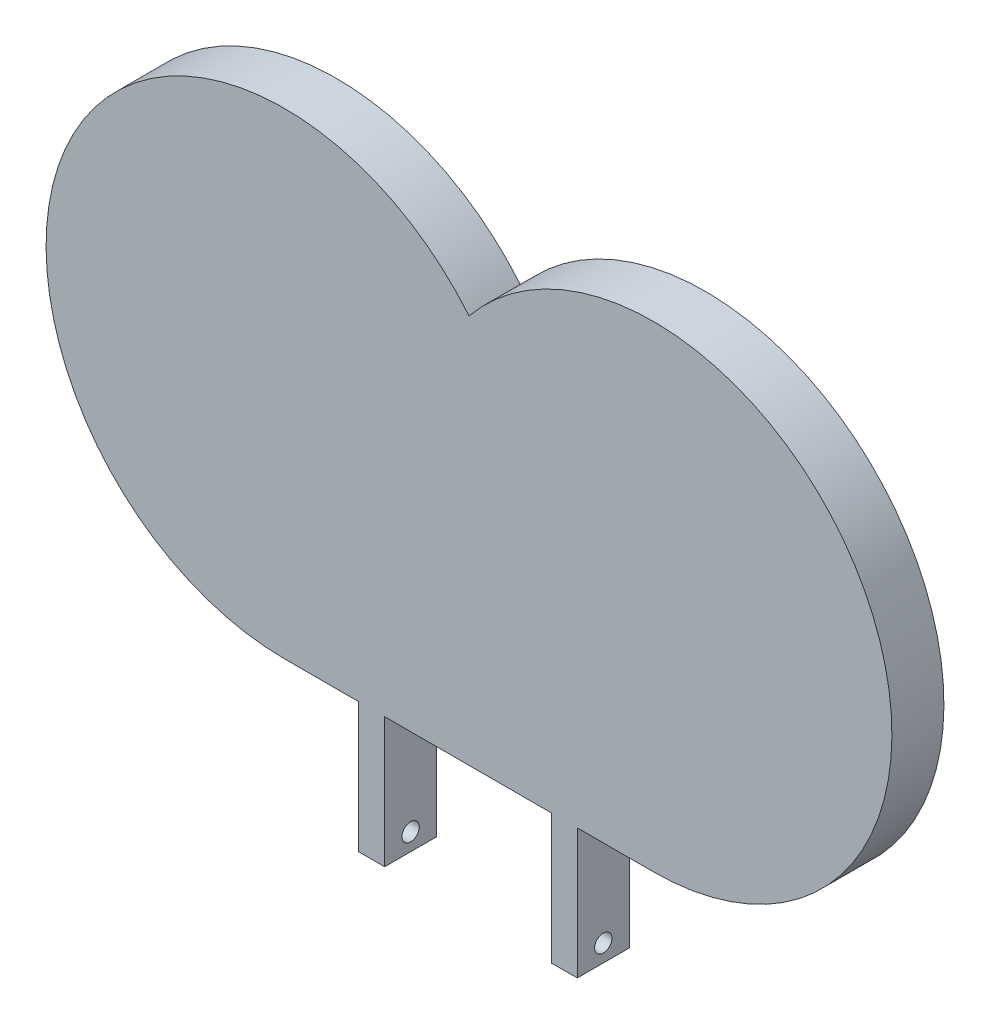
ISO-10303-21;
HEADER;
FILE_DESCRIPTION(('STEP AP214'),'2;1');
FILE_NAME('part.step','',(''),(''),'','','');
FILE_SCHEMA(('AUTOMOTIVE_DESIGN { 1 0 10303 214 1 1 1 1 }'));
ENDSEC;
DATA;
#1=APPLICATION_CONTEXT('core data for automotive mechanical design processes');
#2=APPLICATION_PROTOCOL_DEFINITION('international standard','automotive_design',2000,#1);
#3=PRODUCT_CONTEXT('',#1,'mechanical');
#4=PRODUCT('Part','Part','',(#3));
#5=PRODUCT_RELATED_PRODUCT_CATEGORY('part','',(#4));
#6=PRODUCT_DEFINITION_FORMATION('','',#4);
#7=PRODUCT_DEFINITION_CONTEXT('part definition',#1,'design');
#8=PRODUCT_DEFINITION('design','',#6,#7);
#9=PRODUCT_DEFINITION_SHAPE('','',#8);
#10=(LENGTH_UNIT() NAMED_UNIT(*) SI_UNIT(.MILLI.,.METRE.));
#11=(NAMED_UNIT(*) PLANE_ANGLE_UNIT() SI_UNIT($,.RADIAN.));
#12=(NAMED_UNIT(*) SI_UNIT($,.STERADIAN.) SOLID_ANGLE_UNIT());
#13=UNCERTAINTY_MEASURE_WITH_UNIT(LENGTH_MEASURE(1.E-05),#10,'distance_accuracy_value','');
#14=(GEOMETRIC_REPRESENTATION_CONTEXT(3) GLOBAL_UNCERTAINTY_ASSIGNED_CONTEXT((#13)) GLOBAL_UNIT_ASSIGNED_CONTEXT((#10,
#11,#12)) REPRESENTATION_CONTEXT('',''));
#15=CARTESIAN_POINT('',(0.,0.,0.));
#16=DIRECTION('',(0.,0.,1.));
#17=DIRECTION('',(1.,0.,0.));
#18=AXIS2_PLACEMENT_3D('',#15,#16,#17);
#19=CARTESIAN_POINT('',(-2.88077247963978,-55.,12.));
#20=DIRECTION('',(0.,1.,0.));
#21=DIRECTION('',(-1.,0.,0.));
#22=AXIS2_PLACEMENT_3D('',#19,#20,#21);
#23=PLANE('',#22);
#24=DIRECTION('',(0.,0.,1.));
#25=VECTOR('',#24,1.);
#26=CARTESIAN_POINT('',(64.6953844917242,-55.,12.));
#27=LINE('',#26,#25);
#28=CARTESIAN_POINT('',(64.6953844917242,-55.,0.));
#29=VERTEX_POINT('',#28);
#30=CARTESIAN_POINT('',(64.6953844917242,-55.,12.));
#31=VERTEX_POINT('',#30);
#32=EDGE_CURVE('E239',#29,#31,#27,.T.);
#33=ORIENTED_EDGE('',*,*,#32,.F.);
#34=DIRECTION('',(1.,0.,0.));
#35=VECTOR('',#34,1.);
#36=CARTESIAN_POINT('',(-2.88077247963978,-55.,0.));
#37=LINE('',#36,#35);
#38=CARTESIAN_POINT('',(82.2972741266209,-55.,0.));
#39=VERTEX_POINT('',#38);
#40=EDGE_CURVE('E395',#29,#39,#37,.T.);
#41=ORIENTED_EDGE('',*,*,#40,.T.);
#42=DIRECTION('',(0.,0.,-1.));
#43=VECTOR('',#42,1.);
#44=CARTESIAN_POINT('',(82.2972741266209,-55.,12.));
#45=LINE('',#44,#43);
#46=CARTESIAN_POINT('',(82.2972741266209,-55.,12.));
#47=VERTEX_POINT('',#46);
#48=EDGE_CURVE('E406',#47,#39,#45,.T.);
#49=ORIENTED_EDGE('',*,*,#48,.F.);
#50=DIRECTION('',(1.,0.,0.));
#51=VECTOR('',#50,1.);
#52=CARTESIAN_POINT('',(-2.88077247963978,-55.,12.));
#53=LINE('',#52,#51);
#54=EDGE_CURVE('E56',#31,#47,#53,.T.);
#55=ORIENTED_EDGE('',*,*,#54,.F.);
#56=EDGE_LOOP('',(#33,#41,#49,#55));
#57=FACE_BOUND('',#56,.T.);
#58=ADVANCED_FACE('F39',(#57),#23,.F.);
#59=DIRECTION('',(0.,0.,-1.));
#60=VECTOR('',#59,1.);
#61=CARTESIAN_POINT('',(58.6953844917242,-55.,12.));
#62=LINE('',#61,#60);
#63=CARTESIAN_POINT('',(58.6953844917242,-55.,12.));
#64=VERTEX_POINT('',#63);
#65=CARTESIAN_POINT('',(58.6953844917242,-55.,0.));
#66=VERTEX_POINT('',#65);
#67=EDGE_CURVE('E64',#64,#66,#62,.T.);
#68=ORIENTED_EDGE('',*,*,#67,.F.);
#69=CARTESIAN_POINT('',(20.243778265682,-55.,12.));
#70=VERTEX_POINT('',#69);
#71=EDGE_CURVE('E388',#70,#64,#53,.T.);
#72=ORIENTED_EDGE('',*,*,#71,.F.);
#73=DIRECTION('',(0.,0.,1.));
#74=VECTOR('',#73,1.);
#75=CARTESIAN_POINT('',(20.243778265682,-55.,12.));
#76=LINE('',#75,#74);
#77=CARTESIAN_POINT('',(20.243778265682,-55.,0.));
#78=VERTEX_POINT('',#77);
#79=EDGE_CURVE('E241',#78,#70,#76,.T.);
#80=ORIENTED_EDGE('',*,*,#79,.F.);
#81=CARTESIAN_POINT('',(25.2955482535699,-55.,0.));
#82=VERTEX_POINT('',#81);
#83=EDGE_CURVE('E399',#78,#82,#37,.T.);
#84=ORIENTED_EDGE('',*,*,#83,.T.);
#85=DIRECTION('',(0.,0.,-1.));
#86=VECTOR('',#85,1.);
#87=CARTESIAN_POINT('',(25.2955482535699,-55.,4.99642351007153));
#88=LINE('',#87,#86);
#89=CARTESIAN_POINT('',(25.2955482535699,-55.,4.99642351007153));
#90=VERTEX_POINT('',#89);
#91=EDGE_CURVE('E289',#90,#82,#88,.T.);
#92=ORIENTED_EDGE('',*,*,#91,.F.);
#93=CARTESIAN_POINT('',(29.3632955199094,-55.,4.99642351007153));
#94=DIRECTION('',(0.,-1.,0.));
#95=DIRECTION('',(1.,0.,0.));
#96=AXIS2_PLACEMENT_3D('',#93,#94,#95);
#97=CIRCLE('',#96,4.06774726633952);
#98=CARTESIAN_POINT('',(33.4310427862489,-55.,4.99642351007153));
#99=VERTEX_POINT('',#98);
#100=EDGE_CURVE('E285',#99,#90,#97,.T.);
#101=ORIENTED_EDGE('',*,*,#100,.F.);
#102=DIRECTION('',(0.,0.,1.));
#103=VECTOR('',#102,1.);
#104=CARTESIAN_POINT('',(33.4310427862489,-55.,0.));
#105=LINE('',#104,#103);
#106=CARTESIAN_POINT('',(33.4310427862489,-55.,0.));
#107=VERTEX_POINT('',#106);
#108=EDGE_CURVE('E294',#107,#99,#105,.T.);
#109=ORIENTED_EDGE('',*,*,#108,.F.);
#110=CARTESIAN_POINT('',(35.4224736943736,-55.,0.));
#111=VERTEX_POINT('',#110);
#112=EDGE_CURVE('E400',#107,#111,#37,.T.);
#113=ORIENTED_EDGE('',*,*,#112,.T.);
#114=DIRECTION('',(0.,0.,-1.));
#115=VECTOR('',#114,1.);
#116=CARTESIAN_POINT('',(35.4224736943736,-55.,4.99642351007153));
#117=LINE('',#116,#115);
#118=CARTESIAN_POINT('',(35.4224736943736,-55.,4.99642351007153));
#119=VERTEX_POINT('',#118);
#120=EDGE_CURVE('E316',#119,#111,#117,.T.);
#121=ORIENTED_EDGE('',*,*,#120,.F.);
#122=CARTESIAN_POINT('',(39.4224736943736,-55.,4.99642351007153));
#123=DIRECTION('',(0.,-1.,0.));
#124=DIRECTION('',(1.,0.,0.));
#125=AXIS2_PLACEMENT_3D('',#122,#123,#124);
#126=CIRCLE('',#125,4.);
#127=CARTESIAN_POINT('',(43.4224736943736,-55.,4.99642351007153));
#128=VERTEX_POINT('',#127);
#129=EDGE_CURVE('E312',#128,#119,#126,.T.);
#130=ORIENTED_EDGE('',*,*,#129,.F.);
#131=DIRECTION('',(0.,0.,1.));
#132=VECTOR('',#131,1.);
#133=CARTESIAN_POINT('',(43.4224736943736,-55.,0.));
#134=LINE('',#133,#132);
#135=CARTESIAN_POINT('',(43.4224736943736,-55.,0.));
#136=VERTEX_POINT('',#135);
#137=EDGE_CURVE('E320',#136,#128,#134,.T.);
#138=ORIENTED_EDGE('',*,*,#137,.F.);
#139=CARTESIAN_POINT('',(45.6194139748974,-55.,0.));
#140=VERTEX_POINT('',#139);
#141=EDGE_CURVE('E516',#136,#140,#37,.T.);
#142=ORIENTED_EDGE('',*,*,#141,.T.);
#143=DIRECTION('',(0.,0.,-1.));
#144=VECTOR('',#143,1.);
#145=CARTESIAN_POINT('',(45.6194139748974,-55.,4.99642351007153));
#146=LINE('',#145,#144);
#147=CARTESIAN_POINT('',(45.6194139748974,-55.,4.99642351007153));
#148=VERTEX_POINT('',#147);
#149=EDGE_CURVE('E339',#148,#140,#146,.T.);
#150=ORIENTED_EDGE('',*,*,#149,.F.);
#151=CARTESIAN_POINT('',(49.7535215492287,-55.,4.99642351007153));
#152=DIRECTION('',(0.,-1.,0.));
#153=DIRECTION('',(1.,0.,0.));
#154=AXIS2_PLACEMENT_3D('',#151,#152,#153);
#155=CIRCLE('',#154,4.13410757433132);
#156=CARTESIAN_POINT('',(53.88762912356,-55.,4.99642351007153));
#157=VERTEX_POINT('',#156);
#158=EDGE_CURVE('E284',#157,#148,#155,.T.);
#159=ORIENTED_EDGE('',*,*,#158,.F.);
#160=DIRECTION('',(0.,0.,1.));
#161=VECTOR('',#160,1.);
#162=CARTESIAN_POINT('',(53.88762912356,-55.,0.));
#163=LINE('',#162,#161);
#164=CARTESIAN_POINT('',(53.88762912356,-55.,0.));
#165=VERTEX_POINT('',#164);
#166=EDGE_CURVE('E342',#165,#157,#163,.T.);
#167=ORIENTED_EDGE('',*,*,#166,.F.);
#168=EDGE_CURVE('E519',#165,#66,#37,.T.);
#169=ORIENTED_EDGE('',*,*,#168,.T.);
#170=EDGE_LOOP('',(#68,#72,#80,#84,#92,#101,#109,#113,#121,#130,#138,#142,#150,#159,#167,#169));
#171=FACE_BOUND('',#170,.T.);
#172=ADVANCED_FACE('F474',(#171),#23,.F.);
#173=DIRECTION('',(0.,0.,-1.));
#174=VECTOR('',#173,1.);
#175=CARTESIAN_POINT('',(14.243778265682,-55.,12.));
#176=LINE('',#175,#174);
#177=CARTESIAN_POINT('',(14.243778265682,-55.,12.));
#178=VERTEX_POINT('',#177);
#179=CARTESIAN_POINT('',(14.243778265682,-55.,0.));
#180=VERTEX_POINT('',#179);
#181=EDGE_CURVE('E246',#178,#180,#176,.T.);
#182=ORIENTED_EDGE('',*,*,#181,.F.);
#183=CARTESIAN_POINT('',(-2.88077247963978,-55.,12.));
#184=VERTEX_POINT('',#183);
#185=EDGE_CURVE('E383',#184,#178,#53,.T.);
#186=ORIENTED_EDGE('',*,*,#185,.F.);
#187=DIRECTION('',(0.,0.,-1.));
#188=VECTOR('',#187,1.);
#189=CARTESIAN_POINT('',(-2.88077247963978,-55.,12.));
#190=LINE('',#189,#188);
#191=CARTESIAN_POINT('',(-2.88077247963978,-55.,0.));
#192=VERTEX_POINT('',#191);
#193=EDGE_CURVE('E410',#184,#192,#190,.T.);
#194=ORIENTED_EDGE('',*,*,#193,.T.);
#195=EDGE_CURVE('E396',#192,#180,#37,.T.);
#196=ORIENTED_EDGE('',*,*,#195,.T.);
#197=EDGE_LOOP('',(#182,#186,#194,#196));
#198=FACE_BOUND('',#197,.T.);
#199=ADVANCED_FACE('F579',(#198),#23,.F.);
#200=CARTESIAN_POINT('',(-2.88077247963978,0.,0.));
#201=DIRECTION('',(0.,0.,1.));
#202=DIRECTION('',(1.,0.,0.));
#203=AXIS2_PLACEMENT_3D('',#200,#201,#202);
#204=PLANE('',#203);
#205=ORIENTED_EDGE('',*,*,#112,.F.);
#206=DIRECTION('',(0.,-1.,0.));
#207=VECTOR('',#206,1.);
#208=CARTESIAN_POINT('',(33.4310427862489,-35.,0.));
#209=LINE('',#208,#207);
#210=CARTESIAN_POINT('',(33.4310427862489,-53.5,0.));
#211=VERTEX_POINT('',#210);
#212=EDGE_CURVE('E303',#211,#107,#209,.T.);
#213=ORIENTED_EDGE('',*,*,#212,.F.);
#214=DIRECTION('',(1.,0.,0.));
#215=VECTOR('',#214,1.);
#216=CARTESIAN_POINT('',(-2.88077247963977,-53.5,0.));
#217=LINE('',#216,#215);
#218=CARTESIAN_POINT('',(35.4224736943736,-53.5,0.));
#219=VERTEX_POINT('',#218);
#220=EDGE_CURVE('E424',#211,#219,#217,.T.);
#221=ORIENTED_EDGE('',*,*,#220,.T.);
#222=DIRECTION('',(0.,-1.,0.));
#223=VECTOR('',#222,1.);
#224=CARTESIAN_POINT('',(35.4224736943736,-35.,0.));
#225=LINE('',#224,#223);
#226=EDGE_CURVE('E330',#219,#111,#225,.T.);
#227=ORIENTED_EDGE('',*,*,#226,.T.);
#228=EDGE_LOOP('',(#205,#213,#221,#227));
#229=FACE_BOUND('',#228,.T.);
#230=ADVANCED_FACE('F505',(#229),#204,.F.);
#231=ORIENTED_EDGE('',*,*,#141,.F.);
#232=DIRECTION('',(0.,-1.,0.));
#233=VECTOR('',#232,1.);
#234=CARTESIAN_POINT('',(43.4224736943736,-35.,0.));
#235=LINE('',#234,#233);
#236=CARTESIAN_POINT('',(43.4224736943736,-53.5,0.));
#237=VERTEX_POINT('',#236);
#238=EDGE_CURVE('E327',#237,#136,#235,.T.);
#239=ORIENTED_EDGE('',*,*,#238,.F.);
#240=CARTESIAN_POINT('',(45.6194139748974,-53.5,0.));
#241=VERTEX_POINT('',#240);
#242=EDGE_CURVE('E496',#237,#241,#217,.T.);
#243=ORIENTED_EDGE('',*,*,#242,.T.);
#244=DIRECTION('',(0.,-1.,0.));
#245=VECTOR('',#244,1.);
#246=CARTESIAN_POINT('',(45.6194139748974,-35.,0.));
#247=LINE('',#246,#245);
#248=EDGE_CURVE('E352',#241,#140,#247,.T.);
#249=ORIENTED_EDGE('',*,*,#248,.T.);
#250=EDGE_LOOP('',(#231,#239,#243,#249));
#251=FACE_BOUND('',#250,.T.);
#252=ADVANCED_FACE('F566',(#251),#204,.F.);
#253=CARTESIAN_POINT('',(-2.88077247963978,0.,12.));
#254=DIRECTION('',(0.,0.,-1.));
#255=DIRECTION('',(-1.,0.,0.));
#256=AXIS2_PLACEMENT_3D('',#253,#254,#255);
#257=CYLINDRICAL_SURFACE('',#256,55.);
#258=CARTESIAN_POINT('',(-2.88077247963978,0.,0.));
#259=DIRECTION('',(0.,0.,1.));
#260=DIRECTION('',(1.,0.,0.));
#261=AXIS2_PLACEMENT_3D('',#258,#259,#260);
#262=CIRCLE('',#261,55.);
#263=CARTESIAN_POINT('',(39.7082508234906,34.8019409528466,0.));
#264=VERTEX_POINT('',#263);
#265=EDGE_CURVE('E373',#264,#192,#262,.T.);
#266=ORIENTED_EDGE('',*,*,#265,.T.);
#267=ORIENTED_EDGE('',*,*,#193,.F.);
#268=CARTESIAN_POINT('',(-2.88077247963978,0.,12.));
#269=DIRECTION('',(0.,0.,1.));
#270=DIRECTION('',(1.,0.,0.));
#271=AXIS2_PLACEMENT_3D('',#268,#269,#270);
#272=CIRCLE('',#271,55.);
#273=CARTESIAN_POINT('',(39.7082508234906,34.8019409528466,12.));
#274=VERTEX_POINT('',#273);
#275=EDGE_CURVE('E379',#274,#184,#272,.T.);
#276=ORIENTED_EDGE('',*,*,#275,.F.);
#277=DIRECTION('',(0.,0.,-1.));
#278=VECTOR('',#277,1.);
#279=CARTESIAN_POINT('',(39.7082508234906,34.8019409528466,12.));
#280=LINE('',#279,#278);
#281=EDGE_CURVE('E391',#274,#264,#280,.T.);
#282=ORIENTED_EDGE('',*,*,#281,.T.);
#283=EDGE_LOOP('',(#266,#267,#276,#282));
#284=FACE_BOUND('',#283,.T.);
#285=ADVANCED_FACE('F41',(#284),#257,.T.);
#286=CARTESIAN_POINT('',(82.2972741266209,0.,12.));
#287=DIRECTION('',(0.,0.,-1.));
#288=DIRECTION('',(-1.,0.,0.));
#289=AXIS2_PLACEMENT_3D('',#286,#287,#288);
#290=CYLINDRICAL_SURFACE('',#289,55.);
#291=CARTESIAN_POINT('',(82.2972741266209,0.,0.));
#292=DIRECTION('',(0.,0.,1.));
#293=DIRECTION('',(1.,0.,0.));
#294=AXIS2_PLACEMENT_3D('',#291,#292,#293);
#295=CIRCLE('',#294,55.);
#296=EDGE_CURVE('E382',#39,#264,#295,.T.);
#297=ORIENTED_EDGE('',*,*,#296,.T.);
#298=ORIENTED_EDGE('',*,*,#281,.F.);
#299=CARTESIAN_POINT('',(82.2972741266209,0.,12.));
#300=DIRECTION('',(0.,0.,1.));
#301=DIRECTION('',(1.,0.,0.));
#302=AXIS2_PLACEMENT_3D('',#299,#300,#301);
#303=CIRCLE('',#302,55.);
#304=EDGE_CURVE('E387',#47,#274,#303,.T.);
#305=ORIENTED_EDGE('',*,*,#304,.F.);
#306=ORIENTED_EDGE('',*,*,#48,.T.);
#307=EDGE_LOOP('',(#297,#298,#305,#306));
#308=FACE_BOUND('',#307,.T.);
#309=ADVANCED_FACE('F530',(#308),#290,.T.);
#310=CARTESIAN_POINT('',(-2.88077247963978,0.,12.));
#311=DIRECTION('',(0.,0.,1.));
#312=DIRECTION('',(1.,0.,0.));
#313=AXIS2_PLACEMENT_3D('',#310,#311,#312);
#314=PLANE('',#313);
#315=ORIENTED_EDGE('',*,*,#275,.T.);
#316=ORIENTED_EDGE('',*,*,#185,.T.);
#317=DIRECTION('',(0.,1.,0.));
#318=VECTOR('',#317,1.);
#319=CARTESIAN_POINT('',(14.243778265682,-85.,12.));
#320=LINE('',#319,#318);
#321=CARTESIAN_POINT('',(14.243778265682,-85.,12.));
#322=VERTEX_POINT('',#321);
#323=EDGE_CURVE('E276',#322,#178,#320,.T.);
#324=ORIENTED_EDGE('',*,*,#323,.F.);
#325=DIRECTION('',(-1.,0.,0.));
#326=VECTOR('',#325,1.);
#327=CARTESIAN_POINT('',(20.243778265682,-85.,12.));
#328=LINE('',#327,#326);
#329=CARTESIAN_POINT('',(20.243778265682,-85.,12.));
#330=VERTEX_POINT('',#329);
#331=EDGE_CURVE('E256',#330,#322,#328,.T.);
#332=ORIENTED_EDGE('',*,*,#331,.F.);
#333=DIRECTION('',(0.,1.,0.));
#334=VECTOR('',#333,1.);
#335=CARTESIAN_POINT('',(20.243778265682,-85.,12.));
#336=LINE('',#335,#334);
#337=EDGE_CURVE('E280',#330,#70,#336,.T.);
#338=ORIENTED_EDGE('',*,*,#337,.T.);
#339=ORIENTED_EDGE('',*,*,#71,.T.);
#340=DIRECTION('',(0.,1.,0.));
#341=VECTOR('',#340,1.);
#342=CARTESIAN_POINT('',(58.6953844917242,-85.,12.));
#343=LINE('',#342,#341);
#344=CARTESIAN_POINT('',(58.6953844917242,-85.,12.));
#345=VERTEX_POINT('',#344);
#346=EDGE_CURVE('E222',#345,#64,#343,.T.);
#347=ORIENTED_EDGE('',*,*,#346,.F.);
#348=DIRECTION('',(-1.,0.,0.));
#349=VECTOR('',#348,1.);
#350=CARTESIAN_POINT('',(64.6953844917242,-85.,12.));
#351=LINE('',#350,#349);
#352=CARTESIAN_POINT('',(64.6953844917242,-85.,12.));
#353=VERTEX_POINT('',#352);
#354=EDGE_CURVE('E214',#353,#345,#351,.T.);
#355=ORIENTED_EDGE('',*,*,#354,.F.);
#356=DIRECTION('',(0.,1.,0.));
#357=VECTOR('',#356,1.);
#358=CARTESIAN_POINT('',(64.6953844917242,-85.,12.));
#359=LINE('',#358,#357);
#360=EDGE_CURVE('E219',#353,#31,#359,.T.);
#361=ORIENTED_EDGE('',*,*,#360,.T.);
#362=ORIENTED_EDGE('',*,*,#54,.T.);
#363=ORIENTED_EDGE('',*,*,#304,.T.);
#364=EDGE_LOOP('',(#315,#316,#324,#332,#338,#339,#347,#355,#361,#362,#363));
#365=FACE_BOUND('',#364,.T.);
#366=ADVANCED_FACE('F217',(#365),#314,.T.);
#367=CARTESIAN_POINT('',(-2.88077247963978,-53.5,0.));
#368=VERTEX_POINT('',#367);
#369=CARTESIAN_POINT('',(25.2955482535698,-53.5,0.));
#370=VERTEX_POINT('',#369);
#371=EDGE_CURVE('E419',#368,#370,#217,.T.);
#372=ORIENTED_EDGE('',*,*,#371,.T.);
#373=DIRECTION('',(0.,-1.,0.));
#374=VECTOR('',#373,1.);
#375=CARTESIAN_POINT('',(25.2955482535699,-35.,0.));
#376=LINE('',#375,#374);
#377=EDGE_CURVE('E306',#370,#82,#376,.T.);
#378=ORIENTED_EDGE('',*,*,#377,.T.);
#379=ORIENTED_EDGE('',*,*,#83,.F.);
#380=DIRECTION('',(0.,1.,0.));
#381=VECTOR('',#380,1.);
#382=CARTESIAN_POINT('',(20.243778265682,-85.,0.));
#383=LINE('',#382,#381);
#384=CARTESIAN_POINT('',(20.243778265682,-85.,0.));
#385=VERTEX_POINT('',#384);
#386=EDGE_CURVE('E264',#385,#78,#383,.T.);
#387=ORIENTED_EDGE('',*,*,#386,.F.);
#388=DIRECTION('',(1.,0.,0.));
#389=VECTOR('',#388,1.);
#390=CARTESIAN_POINT('',(20.243778265682,-85.,0.));
#391=LINE('',#390,#389);
#392=CARTESIAN_POINT('',(14.243778265682,-85.,0.));
#393=VERTEX_POINT('',#392);
#394=EDGE_CURVE('E262',#393,#385,#391,.T.);
#395=ORIENTED_EDGE('',*,*,#394,.F.);
#396=DIRECTION('',(0.,1.,0.));
#397=VECTOR('',#396,1.);
#398=CARTESIAN_POINT('',(14.243778265682,-85.,0.));
#399=LINE('',#398,#397);
#400=EDGE_CURVE('E272',#393,#180,#399,.T.);
#401=ORIENTED_EDGE('',*,*,#400,.T.);
#402=ORIENTED_EDGE('',*,*,#195,.F.);
#403=ORIENTED_EDGE('',*,*,#265,.F.);
#404=ORIENTED_EDGE('',*,*,#296,.F.);
#405=ORIENTED_EDGE('',*,*,#40,.F.);
#406=DIRECTION('',(0.,1.,0.));
#407=VECTOR('',#406,1.);
#408=CARTESIAN_POINT('',(64.6953844917242,-85.,0.));
#409=LINE('',#408,#407);
#410=CARTESIAN_POINT('',(64.6953844917242,-85.,0.));
#411=VERTEX_POINT('',#410);
#412=EDGE_CURVE('E547',#411,#29,#409,.T.);
#413=ORIENTED_EDGE('',*,*,#412,.F.);
#414=DIRECTION('',(1.,0.,0.));
#415=VECTOR('',#414,1.);
#416=CARTESIAN_POINT('',(64.6953844917242,-85.,0.));
#417=LINE('',#416,#415);
#418=CARTESIAN_POINT('',(58.6953844917242,-85.,0.));
#419=VERTEX_POINT('',#418);
#420=EDGE_CURVE('E232',#419,#411,#417,.T.);
#421=ORIENTED_EDGE('',*,*,#420,.F.);
#422=DIRECTION('',(0.,1.,0.));
#423=VECTOR('',#422,1.);
#424=CARTESIAN_POINT('',(58.6953844917242,-85.,0.));
#425=LINE('',#424,#423);
#426=EDGE_CURVE('E248',#419,#66,#425,.T.);
#427=ORIENTED_EDGE('',*,*,#426,.T.);
#428=ORIENTED_EDGE('',*,*,#168,.F.);
#429=DIRECTION('',(0.,-1.,0.));
#430=VECTOR('',#429,1.);
#431=CARTESIAN_POINT('',(53.88762912356,-35.,0.));
#432=LINE('',#431,#430);
#433=CARTESIAN_POINT('',(53.88762912356,-53.5,0.));
#434=VERTEX_POINT('',#433);
#435=EDGE_CURVE('E349',#434,#165,#432,.T.);
#436=ORIENTED_EDGE('',*,*,#435,.F.);
#437=CARTESIAN_POINT('',(82.2972741266209,-53.5,0.));
#438=VERTEX_POINT('',#437);
#439=EDGE_CURVE('E418',#434,#438,#217,.T.);
#440=ORIENTED_EDGE('',*,*,#439,.T.);
#441=CARTESIAN_POINT('',(82.2972741266209,0.,0.));
#442=DIRECTION('',(0.,0.,1.));
#443=DIRECTION('',(1.,0.,0.));
#444=AXIS2_PLACEMENT_3D('',#441,#442,#443);
#445=CIRCLE('',#444,53.5);
#446=CARTESIAN_POINT('',(39.7082508234906,32.3793930468966,0.));
#447=VERTEX_POINT('',#446);
#448=EDGE_CURVE('E423',#438,#447,#445,.T.);
#449=ORIENTED_EDGE('',*,*,#448,.T.);
#450=CARTESIAN_POINT('',(-2.88077247963978,0.,0.));
#451=DIRECTION('',(0.,0.,1.));
#452=DIRECTION('',(1.,0.,0.));
#453=AXIS2_PLACEMENT_3D('',#450,#451,#452);
#454=CIRCLE('',#453,53.5);
#455=EDGE_CURVE('E414',#447,#368,#454,.T.);
#456=ORIENTED_EDGE('',*,*,#455,.T.);
#457=EDGE_LOOP('',(#372,#378,#379,#387,#395,#401,#402,#403,#404,#405,#413,#421,#427,#428,#436,
#440,#449,#456));
#458=FACE_BOUND('',#457,.T.);
#459=ADVANCED_FACE('F479',(#458),#204,.F.);
#460=CARTESIAN_POINT('',(82.2972741266209,0.,-10.));
#461=DIRECTION('',(0.,0.,1.));
#462=DIRECTION('',(1.,0.,0.));
#463=AXIS2_PLACEMENT_3D('',#460,#461,#462);
#464=CYLINDRICAL_SURFACE('',#463,53.5);
#465=DIRECTION('',(0.,0.,1.));
#466=VECTOR('',#465,1.);
#467=CARTESIAN_POINT('',(82.2972741266209,-53.5,-10.));
#468=LINE('',#467,#466);
#469=CARTESIAN_POINT('',(82.2972741266209,-53.5,10.));
#470=VERTEX_POINT('',#469);
#471=EDGE_CURVE('E370',#438,#470,#468,.T.);
#472=ORIENTED_EDGE('',*,*,#471,.T.);
#473=CARTESIAN_POINT('',(82.2972741266209,0.,10.));
#474=DIRECTION('',(0.,0.,1.));
#475=DIRECTION('',(1.,0.,0.));
#476=AXIS2_PLACEMENT_3D('',#473,#474,#475);
#477=CIRCLE('',#476,53.5);
#478=CARTESIAN_POINT('',(39.7082508234906,32.3793930468966,10.));
#479=VERTEX_POINT('',#478);
#480=EDGE_CURVE('E302',#470,#479,#477,.T.);
#481=ORIENTED_EDGE('',*,*,#480,.T.);
#482=DIRECTION('',(0.,0.,1.));
#483=VECTOR('',#482,1.);
#484=CARTESIAN_POINT('',(39.7082508234906,32.3793930468966,-10.));
#485=LINE('',#484,#483);
#486=EDGE_CURVE('E369',#447,#479,#485,.T.);
#487=ORIENTED_EDGE('',*,*,#486,.F.);
#488=ORIENTED_EDGE('',*,*,#448,.F.);
#489=EDGE_LOOP('',(#472,#481,#487,#488));
#490=FACE_BOUND('',#489,.T.);
#491=ADVANCED_FACE('F491',(#490),#464,.F.);
#492=CARTESIAN_POINT('',(82.2972741266209,-53.5,-10.));
#493=DIRECTION('',(0.,-1.,0.));
#494=DIRECTION('',(1.,0.,0.));
#495=AXIS2_PLACEMENT_3D('',#492,#493,#494);
#496=PLANE('',#495);
#497=ORIENTED_EDGE('',*,*,#220,.F.);
#498=DIRECTION('',(0.,0.,1.));
#499=VECTOR('',#498,1.);
#500=CARTESIAN_POINT('',(33.4310427862489,-53.5,-10.));
#501=LINE('',#500,#499);
#502=CARTESIAN_POINT('',(33.4310427862489,-53.5,4.99642351007153));
#503=VERTEX_POINT('',#502);
#504=EDGE_CURVE('E11',#211,#503,#501,.T.);
#505=ORIENTED_EDGE('',*,*,#504,.T.);
#506=CARTESIAN_POINT('',(29.3632955199094,-53.5,4.99642351007153));
#507=DIRECTION('',(0.,-1.,0.));
#508=DIRECTION('',(1.,0.,0.));
#509=AXIS2_PLACEMENT_3D('',#506,#507,#508);
#510=CIRCLE('',#509,4.06774726633952);
#511=CARTESIAN_POINT('',(25.2955482535699,-53.5,4.99642351007153));
#512=VERTEX_POINT('',#511);
#513=EDGE_CURVE('E49',#503,#512,#510,.T.);
#514=ORIENTED_EDGE('',*,*,#513,.T.);
#515=DIRECTION('',(0.,0.,-1.));
#516=VECTOR('',#515,1.);
#517=CARTESIAN_POINT('',(25.2955482535698,-53.5,-10.));
#518=LINE('',#517,#516);
#519=EDGE_CURVE('E452',#512,#370,#518,.T.);
#520=ORIENTED_EDGE('',*,*,#519,.T.);
#521=ORIENTED_EDGE('',*,*,#371,.F.);
#522=DIRECTION('',(0.,0.,1.));
#523=VECTOR('',#522,1.);
#524=CARTESIAN_POINT('',(-2.88077247963978,-53.5,-10.));
#525=LINE('',#524,#523);
#526=CARTESIAN_POINT('',(-2.88077247963978,-53.5,10.));
#527=VERTEX_POINT('',#526);
#528=EDGE_CURVE('E374',#368,#527,#525,.T.);
#529=ORIENTED_EDGE('',*,*,#528,.T.);
#530=DIRECTION('',(1.,0.,0.));
#531=VECTOR('',#530,1.);
#532=CARTESIAN_POINT('',(82.2972741266209,-53.5,10.));
#533=LINE('',#532,#531);
#534=EDGE_CURVE('E365',#527,#470,#533,.T.);
#535=ORIENTED_EDGE('',*,*,#534,.T.);
#536=ORIENTED_EDGE('',*,*,#471,.F.);
#537=ORIENTED_EDGE('',*,*,#439,.F.);
#538=DIRECTION('',(0.,0.,1.));
#539=VECTOR('',#538,1.);
#540=CARTESIAN_POINT('',(53.88762912356,-53.5,-10.));
#541=LINE('',#540,#539);
#542=CARTESIAN_POINT('',(53.88762912356,-53.5,4.99642351007153));
#543=VERTEX_POINT('',#542);
#544=EDGE_CURVE('E436',#434,#543,#541,.T.);
#545=ORIENTED_EDGE('',*,*,#544,.T.);
#546=CARTESIAN_POINT('',(49.7535215492287,-53.5,4.99642351007153));
#547=DIRECTION('',(0.,-1.,0.));
#548=DIRECTION('',(1.,0.,0.));
#549=AXIS2_PLACEMENT_3D('',#546,#547,#548);
#550=CIRCLE('',#549,4.13410757433132);
#551=CARTESIAN_POINT('',(45.6194139748974,-53.5,4.99642351007153));
#552=VERTEX_POINT('',#551);
#553=EDGE_CURVE('E432',#543,#552,#550,.T.);
#554=ORIENTED_EDGE('',*,*,#553,.T.);
#555=DIRECTION('',(0.,0.,-1.));
#556=VECTOR('',#555,1.);
#557=CARTESIAN_POINT('',(45.6194139748974,-53.5,-10.));
#558=LINE('',#557,#556);
#559=EDGE_CURVE('E428',#552,#241,#558,.T.);
#560=ORIENTED_EDGE('',*,*,#559,.T.);
#561=ORIENTED_EDGE('',*,*,#242,.F.);
#562=DIRECTION('',(0.,0.,1.));
#563=VECTOR('',#562,1.);
#564=CARTESIAN_POINT('',(43.4224736943736,-53.5,-10.));
#565=LINE('',#564,#563);
#566=CARTESIAN_POINT('',(43.4224736943736,-53.5,4.99642351007153));
#567=VERTEX_POINT('',#566);
#568=EDGE_CURVE('E448',#237,#567,#565,.T.);
#569=ORIENTED_EDGE('',*,*,#568,.T.);
#570=CARTESIAN_POINT('',(39.4224736943736,-53.5,4.99642351007153));
#571=DIRECTION('',(0.,-1.,0.));
#572=DIRECTION('',(1.,0.,0.));
#573=AXIS2_PLACEMENT_3D('',#570,#571,#572);
#574=CIRCLE('',#573,4.);
#575=CARTESIAN_POINT('',(35.4224736943736,-53.5,4.99642351007153));
#576=VERTEX_POINT('',#575);
#577=EDGE_CURVE('E444',#567,#576,#574,.T.);
#578=ORIENTED_EDGE('',*,*,#577,.T.);
#579=DIRECTION('',(0.,0.,-1.));
#580=VECTOR('',#579,1.);
#581=CARTESIAN_POINT('',(35.4224736943736,-53.5,-10.));
#582=LINE('',#581,#580);
#583=EDGE_CURVE('E440',#576,#219,#582,.T.);
#584=ORIENTED_EDGE('',*,*,#583,.T.);
#585=EDGE_LOOP('',(#497,#505,#514,#520,#521,#529,#535,#536,#537,#545,#554,#560,#561,#569,#578,#584));
#586=FACE_BOUND('',#585,.T.);
#587=ADVANCED_FACE('F460',(#586),#496,.F.);
#588=CARTESIAN_POINT('',(-2.88077247963978,0.,-10.));
#589=DIRECTION('',(0.,0.,1.));
#590=DIRECTION('',(1.,0.,0.));
#591=AXIS2_PLACEMENT_3D('',#588,#589,#590);
#592=CYLINDRICAL_SURFACE('',#591,53.5);
#593=ORIENTED_EDGE('',*,*,#486,.T.);
#594=CARTESIAN_POINT('',(-2.88077247963978,0.,10.));
#595=DIRECTION('',(0.,0.,1.));
#596=DIRECTION('',(1.,0.,0.));
#597=AXIS2_PLACEMENT_3D('',#594,#595,#596);
#598=CIRCLE('',#597,53.5);
#599=EDGE_CURVE('E361',#479,#527,#598,.T.);
#600=ORIENTED_EDGE('',*,*,#599,.T.);
#601=ORIENTED_EDGE('',*,*,#528,.F.);
#602=ORIENTED_EDGE('',*,*,#455,.F.);
#603=EDGE_LOOP('',(#593,#600,#601,#602));
#604=FACE_BOUND('',#603,.T.);
#605=ADVANCED_FACE('F485',(#604),#592,.F.);
#606=CARTESIAN_POINT('',(82.2972741266209,0.,10.));
#607=DIRECTION('',(0.,0.,1.));
#608=DIRECTION('',(1.,0.,0.));
#609=AXIS2_PLACEMENT_3D('',#606,#607,#608);
#610=PLANE('',#609);
#611=ORIENTED_EDGE('',*,*,#480,.F.);
#612=ORIENTED_EDGE('',*,*,#534,.F.);
#613=ORIENTED_EDGE('',*,*,#599,.F.);
#614=EDGE_LOOP('',(#611,#612,#613));
#615=FACE_BOUND('',#614,.T.);
#616=ADVANCED_FACE('F489',(#615),#610,.F.);
#617=CARTESIAN_POINT('',(49.7535215492287,-35.,4.99642351007153));
#618=DIRECTION('',(0.,-1.,0.));
#619=DIRECTION('',(1.,0.,0.));
#620=AXIS2_PLACEMENT_3D('',#617,#618,#619);
#621=CYLINDRICAL_SURFACE('',#620,4.13410757433132);
#622=DIRECTION('',(0.,-1.,0.));
#623=VECTOR('',#622,1.);
#624=CARTESIAN_POINT('',(53.88762912356,-35.,4.99642351007153));
#625=LINE('',#624,#623);
#626=EDGE_CURVE('E317',#543,#157,#625,.T.);
#627=ORIENTED_EDGE('',*,*,#626,.T.);
#628=ORIENTED_EDGE('',*,*,#158,.T.);
#629=DIRECTION('',(0.,-1.,0.));
#630=VECTOR('',#629,1.);
#631=CARTESIAN_POINT('',(45.6194139748974,-35.,4.99642351007153));
#632=LINE('',#631,#630);
#633=EDGE_CURVE('E346',#552,#148,#632,.T.);
#634=ORIENTED_EDGE('',*,*,#633,.F.);
#635=ORIENTED_EDGE('',*,*,#553,.F.);
#636=EDGE_LOOP('',(#627,#628,#634,#635));
#637=FACE_BOUND('',#636,.T.);
#638=ADVANCED_FACE('F563',(#637),#621,.F.);
#639=CARTESIAN_POINT('',(53.88762912356,-35.,0.));
#640=DIRECTION('',(1.,0.,0.));
#641=DIRECTION('',(0.,1.,0.));
#642=AXIS2_PLACEMENT_3D('',#639,#640,#641);
#643=PLANE('',#642);
#644=ORIENTED_EDGE('',*,*,#435,.T.);
#645=ORIENTED_EDGE('',*,*,#166,.T.);
#646=ORIENTED_EDGE('',*,*,#626,.F.);
#647=ORIENTED_EDGE('',*,*,#544,.F.);
#648=EDGE_LOOP('',(#644,#645,#646,#647));
#649=FACE_BOUND('',#648,.T.);
#650=ADVANCED_FACE('F558',(#649),#643,.F.);
#651=CARTESIAN_POINT('',(45.6194139748974,-35.,4.99642351007153));
#652=DIRECTION('',(-1.,0.,0.));
#653=DIRECTION('',(0.,-1.,0.));
#654=AXIS2_PLACEMENT_3D('',#651,#652,#653);
#655=PLANE('',#654);
#656=ORIENTED_EDGE('',*,*,#633,.T.);
#657=ORIENTED_EDGE('',*,*,#149,.T.);
#658=ORIENTED_EDGE('',*,*,#248,.F.);
#659=ORIENTED_EDGE('',*,*,#559,.F.);
#660=EDGE_LOOP('',(#656,#657,#658,#659));
#661=FACE_BOUND('',#660,.T.);
#662=ADVANCED_FACE('F565',(#661),#655,.F.);
#663=CARTESIAN_POINT('',(39.4224736943736,-35.,4.99642351007153));
#664=DIRECTION('',(0.,-1.,0.));
#665=DIRECTION('',(1.,0.,0.));
#666=AXIS2_PLACEMENT_3D('',#663,#664,#665);
#667=CYLINDRICAL_SURFACE('',#666,4.);
#668=DIRECTION('',(0.,-1.,0.));
#669=VECTOR('',#668,1.);
#670=CARTESIAN_POINT('',(43.4224736943736,-35.,4.99642351007153));
#671=LINE('',#670,#669);
#672=EDGE_CURVE('E290',#567,#128,#671,.T.);
#673=ORIENTED_EDGE('',*,*,#672,.T.);
#674=ORIENTED_EDGE('',*,*,#129,.T.);
#675=DIRECTION('',(0.,-1.,0.));
#676=VECTOR('',#675,1.);
#677=CARTESIAN_POINT('',(35.4224736943736,-35.,4.99642351007153));
#678=LINE('',#677,#676);
#679=EDGE_CURVE('E324',#576,#119,#678,.T.);
#680=ORIENTED_EDGE('',*,*,#679,.F.);
#681=ORIENTED_EDGE('',*,*,#577,.F.);
#682=EDGE_LOOP('',(#673,#674,#680,#681));
#683=FACE_BOUND('',#682,.T.);
#684=ADVANCED_FACE('F510',(#683),#667,.F.);
#685=CARTESIAN_POINT('',(43.4224736943736,-35.,0.));
#686=DIRECTION('',(1.,0.,0.));
#687=DIRECTION('',(0.,1.,0.));
#688=AXIS2_PLACEMENT_3D('',#685,#686,#687);
#689=PLANE('',#688);
#690=ORIENTED_EDGE('',*,*,#238,.T.);
#691=ORIENTED_EDGE('',*,*,#137,.T.);
#692=ORIENTED_EDGE('',*,*,#672,.F.);
#693=ORIENTED_EDGE('',*,*,#568,.F.);
#694=EDGE_LOOP('',(#690,#691,#692,#693));
#695=FACE_BOUND('',#694,.T.);
#696=ADVANCED_FACE('F568',(#695),#689,.F.);
#697=CARTESIAN_POINT('',(35.4224736943736,-35.,4.99642351007153));
#698=DIRECTION('',(-1.,0.,0.));
#699=DIRECTION('',(0.,-1.,0.));
#700=AXIS2_PLACEMENT_3D('',#697,#698,#699);
#701=PLANE('',#700);
#702=ORIENTED_EDGE('',*,*,#679,.T.);
#703=ORIENTED_EDGE('',*,*,#120,.T.);
#704=ORIENTED_EDGE('',*,*,#226,.F.);
#705=ORIENTED_EDGE('',*,*,#583,.F.);
#706=EDGE_LOOP('',(#702,#703,#704,#705));
#707=FACE_BOUND('',#706,.T.);
#708=ADVANCED_FACE('F508',(#707),#701,.F.);
#709=CARTESIAN_POINT('',(29.3632955199094,-35.,4.99642351007153));
#710=DIRECTION('',(0.,-1.,0.));
#711=DIRECTION('',(1.,0.,0.));
#712=AXIS2_PLACEMENT_3D('',#709,#710,#711);
#713=CYLINDRICAL_SURFACE('',#712,4.06774726633952);
#714=DIRECTION('',(0.,-1.,0.));
#715=VECTOR('',#714,1.);
#716=CARTESIAN_POINT('',(33.4310427862489,-35.,4.99642351007153));
#717=LINE('',#716,#715);
#718=EDGE_CURVE('E299',#503,#99,#717,.T.);
#719=ORIENTED_EDGE('',*,*,#718,.T.);
#720=ORIENTED_EDGE('',*,*,#100,.T.);
#721=DIRECTION('',(0.,-1.,0.));
#722=VECTOR('',#721,1.);
#723=CARTESIAN_POINT('',(25.2955482535699,-35.,4.99642351007153));
#724=LINE('',#723,#722);
#725=EDGE_CURVE('E298',#512,#90,#724,.T.);
#726=ORIENTED_EDGE('',*,*,#725,.F.);
#727=ORIENTED_EDGE('',*,*,#513,.F.);
#728=EDGE_LOOP('',(#719,#720,#726,#727));
#729=FACE_BOUND('',#728,.T.);
#730=ADVANCED_FACE('F465',(#729),#713,.F.);
#731=CARTESIAN_POINT('',(33.4310427862489,-35.,0.));
#732=DIRECTION('',(1.,0.,0.));
#733=DIRECTION('',(0.,1.,0.));
#734=AXIS2_PLACEMENT_3D('',#731,#732,#733);
#735=PLANE('',#734);
#736=ORIENTED_EDGE('',*,*,#212,.T.);
#737=ORIENTED_EDGE('',*,*,#108,.T.);
#738=ORIENTED_EDGE('',*,*,#718,.F.);
#739=ORIENTED_EDGE('',*,*,#504,.F.);
#740=EDGE_LOOP('',(#736,#737,#738,#739));
#741=FACE_BOUND('',#740,.T.);
#742=ADVANCED_FACE('F467',(#741),#735,.F.);
#743=CARTESIAN_POINT('',(25.2955482535699,-35.,4.99642351007153));
#744=DIRECTION('',(-1.,0.,0.));
#745=DIRECTION('',(0.,-1.,0.));
#746=AXIS2_PLACEMENT_3D('',#743,#744,#745);
#747=PLANE('',#746);
#748=ORIENTED_EDGE('',*,*,#725,.T.);
#749=ORIENTED_EDGE('',*,*,#91,.T.);
#750=ORIENTED_EDGE('',*,*,#377,.F.);
#751=ORIENTED_EDGE('',*,*,#519,.F.);
#752=EDGE_LOOP('',(#748,#749,#750,#751));
#753=FACE_BOUND('',#752,.T.);
#754=ADVANCED_FACE('F477',(#753),#747,.F.);
#755=CARTESIAN_POINT('',(20.243778265682,-85.,12.));
#756=DIRECTION('',(-1.,0.,0.));
#757=DIRECTION('',(0.,-1.,0.));
#758=AXIS2_PLACEMENT_3D('',#755,#756,#757);
#759=PLANE('',#758);
#760=CARTESIAN_POINT('',(20.243778265682,-81.0046471874656,6.));
#761=DIRECTION('',(-1.,0.,0.));
#762=DIRECTION('',(0.,-1.,0.));
#763=AXIS2_PLACEMENT_3D('',#760,#761,#762);
#764=CIRCLE('',#763,2.);
#765=CARTESIAN_POINT('',(20.243778265682,-83.0046471874656,6.));
#766=VERTEX_POINT('',#765);
#767=EDGE_CURVE('E552',#766,#766,#764,.T.);
#768=ORIENTED_EDGE('',*,*,#767,.T.);
#769=EDGE_LOOP('',(#768));
#770=FACE_BOUND('',#769,.T.);
#771=ORIENTED_EDGE('',*,*,#79,.T.);
#772=ORIENTED_EDGE('',*,*,#337,.F.);
#773=DIRECTION('',(0.,0.,1.));
#774=VECTOR('',#773,1.);
#775=CARTESIAN_POINT('',(20.243778265682,-85.,12.));
#776=LINE('',#775,#774);
#777=EDGE_CURVE('E252',#385,#330,#776,.T.);
#778=ORIENTED_EDGE('',*,*,#777,.F.);
#779=ORIENTED_EDGE('',*,*,#386,.T.);
#780=EDGE_LOOP('',(#771,#772,#778,#779));
#781=FACE_BOUND('',#780,.T.);
#782=ADVANCED_FACE('F599',(#770,#781),#759,.F.);
#783=CARTESIAN_POINT('',(14.243778265682,-85.,12.));
#784=DIRECTION('',(1.,0.,0.));
#785=DIRECTION('',(0.,1.,0.));
#786=AXIS2_PLACEMENT_3D('',#783,#784,#785);
#787=PLANE('',#786);
#788=CARTESIAN_POINT('',(14.243778265682,-81.0046471874656,6.));
#789=DIRECTION('',(1.,0.,0.));
#790=DIRECTION('',(0.,1.,0.));
#791=AXIS2_PLACEMENT_3D('',#788,#789,#790);
#792=CIRCLE('',#791,2.);
#793=CARTESIAN_POINT('',(14.243778265682,-79.0046471874656,6.));
#794=VERTEX_POINT('',#793);
#795=EDGE_CURVE('E729',#794,#794,#792,.T.);
#796=ORIENTED_EDGE('',*,*,#795,.T.);
#797=EDGE_LOOP('',(#796));
#798=FACE_BOUND('',#797,.T.);
#799=ORIENTED_EDGE('',*,*,#181,.T.);
#800=ORIENTED_EDGE('',*,*,#400,.F.);
#801=DIRECTION('',(0.,0.,-1.));
#802=VECTOR('',#801,1.);
#803=CARTESIAN_POINT('',(14.243778265682,-85.,12.));
#804=LINE('',#803,#802);
#805=EDGE_CURVE('E259',#322,#393,#804,.T.);
#806=ORIENTED_EDGE('',*,*,#805,.F.);
#807=ORIENTED_EDGE('',*,*,#323,.T.);
#808=EDGE_LOOP('',(#799,#800,#806,#807));
#809=FACE_BOUND('',#808,.T.);
#810=ADVANCED_FACE('F592',(#798,#809),#787,.F.);
#811=CARTESIAN_POINT('',(0.,-85.,0.));
#812=DIRECTION('',(0.,1.,0.));
#813=DIRECTION('',(0.,0.,1.));
#814=AXIS2_PLACEMENT_3D('',#811,#812,#813);
#815=PLANE('',#814);
#816=ORIENTED_EDGE('',*,*,#777,.T.);
#817=ORIENTED_EDGE('',*,*,#331,.T.);
#818=ORIENTED_EDGE('',*,*,#805,.T.);
#819=ORIENTED_EDGE('',*,*,#394,.T.);
#820=EDGE_LOOP('',(#816,#817,#818,#819));
#821=FACE_BOUND('',#820,.T.);
#822=ADVANCED_FACE('F597',(#821),#815,.F.);
#823=CARTESIAN_POINT('',(64.6953844917242,-85.,12.));
#824=DIRECTION('',(-1.,0.,0.));
#825=DIRECTION('',(0.,-1.,0.));
#826=AXIS2_PLACEMENT_3D('',#823,#824,#825);
#827=PLANE('',#826);
#828=CARTESIAN_POINT('',(64.6953844917242,-81.0046471874655,6.));
#829=DIRECTION('',(1.,0.,0.));
#830=DIRECTION('',(0.,1.,0.));
#831=AXIS2_PLACEMENT_3D('',#828,#829,#830);
#832=CIRCLE('',#831,2.);
#833=CARTESIAN_POINT('',(64.6953844917242,-79.0046471874655,6.));
#834=VERTEX_POINT('',#833);
#835=EDGE_CURVE('E736',#834,#834,#832,.T.);
#836=ORIENTED_EDGE('',*,*,#835,.F.);
#837=EDGE_LOOP('',(#836));
#838=FACE_BOUND('',#837,.T.);
#839=ORIENTED_EDGE('',*,*,#32,.T.);
#840=ORIENTED_EDGE('',*,*,#360,.F.);
#841=DIRECTION('',(0.,0.,1.));
#842=VECTOR('',#841,1.);
#843=CARTESIAN_POINT('',(64.6953844917242,-85.,12.));
#844=LINE('',#843,#842);
#845=EDGE_CURVE('E227',#411,#353,#844,.T.);
#846=ORIENTED_EDGE('',*,*,#845,.F.);
#847=ORIENTED_EDGE('',*,*,#412,.T.);
#848=EDGE_LOOP('',(#839,#840,#846,#847));
#849=FACE_BOUND('',#848,.T.);
#850=ADVANCED_FACE('F238',(#838,#849),#827,.F.);
#851=CARTESIAN_POINT('',(58.6953844917242,-85.,12.));
#852=DIRECTION('',(1.,0.,0.));
#853=DIRECTION('',(0.,1.,0.));
#854=AXIS2_PLACEMENT_3D('',#851,#852,#853);
#855=PLANE('',#854);
#856=CARTESIAN_POINT('',(58.6953844917242,-81.0046471874655,6.));
#857=DIRECTION('',(1.,0.,0.));
#858=DIRECTION('',(0.,1.,0.));
#859=AXIS2_PLACEMENT_3D('',#856,#857,#858);
#860=CIRCLE('',#859,2.);
#861=CARTESIAN_POINT('',(58.6953844917242,-79.0046471874655,6.));
#862=VERTEX_POINT('',#861);
#863=EDGE_CURVE('E43',#862,#862,#860,.T.);
#864=ORIENTED_EDGE('',*,*,#863,.T.);
#865=EDGE_LOOP('',(#864));
#866=FACE_BOUND('',#865,.T.);
#867=ORIENTED_EDGE('',*,*,#67,.T.);
#868=ORIENTED_EDGE('',*,*,#426,.F.);
#869=DIRECTION('',(0.,0.,-1.));
#870=VECTOR('',#869,1.);
#871=CARTESIAN_POINT('',(58.6953844917242,-85.,12.));
#872=LINE('',#871,#870);
#873=EDGE_CURVE('E226',#345,#419,#872,.T.);
#874=ORIENTED_EDGE('',*,*,#873,.F.);
#875=ORIENTED_EDGE('',*,*,#346,.T.);
#876=EDGE_LOOP('',(#867,#868,#874,#875));
#877=FACE_BOUND('',#876,.T.);
#878=ADVANCED_FACE('F541',(#866,#877),#855,.F.);
#879=CARTESIAN_POINT('',(0.,-85.0000000000001,0.));
#880=DIRECTION('',(0.,1.,0.));
#881=DIRECTION('',(-1.,0.,0.));
#882=AXIS2_PLACEMENT_3D('',#879,#880,#881);
#883=PLANE('',#882);
#884=ORIENTED_EDGE('',*,*,#845,.T.);
#885=ORIENTED_EDGE('',*,*,#354,.T.);
#886=ORIENTED_EDGE('',*,*,#873,.T.);
#887=ORIENTED_EDGE('',*,*,#420,.T.);
#888=EDGE_LOOP('',(#884,#885,#886,#887));
#889=FACE_BOUND('',#888,.T.);
#890=ADVANCED_FACE('F230',(#889),#883,.F.);
#891=CARTESIAN_POINT('',(4.69538449172424,-81.0046471874656,6.));
#892=DIRECTION('',(1.,0.,0.));
#893=DIRECTION('',(0.,1.,0.));
#894=AXIS2_PLACEMENT_3D('',#891,#892,#893);
#895=CYLINDRICAL_SURFACE('',#894,2.);
#896=ORIENTED_EDGE('',*,*,#835,.T.);
#897=EDGE_LOOP('',(#896));
#898=FACE_BOUND('',#897,.T.);
#899=ORIENTED_EDGE('',*,*,#863,.F.);
#900=EDGE_LOOP('',(#899));
#901=FACE_BOUND('',#900,.T.);
#902=ADVANCED_FACE('F679',(#898,#901),#895,.F.);
#903=ORIENTED_EDGE('',*,*,#795,.F.);
#904=EDGE_LOOP('',(#903));
#905=FACE_BOUND('',#904,.T.);
#906=ORIENTED_EDGE('',*,*,#767,.F.);
#907=EDGE_LOOP('',(#906));
#908=FACE_BOUND('',#907,.T.);
#909=ADVANCED_FACE('F713',(#905,#908),#895,.F.);
#910=CLOSED_SHELL('',(#58,#172,#199,#230,#252,#285,#309,#366,#459,#491,#587,#605,#616,#638,#650,
#662,#684,#696,#708,#730,#742,#754,#782,#810,#822,#850,#878,#890,#902,#909));
#911=MANIFOLD_SOLID_BREP('B2',#910);
#912=ADVANCED_BREP_SHAPE_REPRESENTATION('',(#18,#911),#14);
#913=SHAPE_DEFINITION_REPRESENTATION(#9,#912);
ENDSEC;
END-ISO-10303-21;
